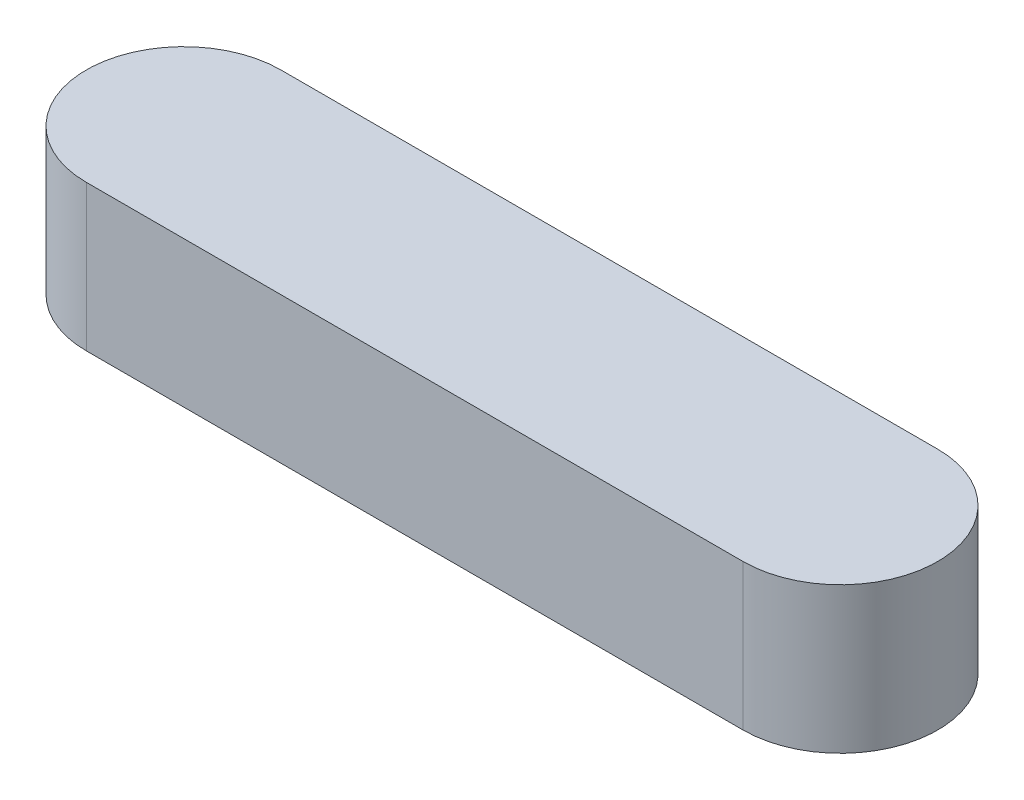
ISO-10303-21;
HEADER;
FILE_DESCRIPTION(('STEP AP214'),'2;1');
FILE_NAME('part.step','',(''),(''),'','','');
FILE_SCHEMA(('AUTOMOTIVE_DESIGN { 1 0 10303 214 1 1 1 1 }'));
ENDSEC;
DATA;
#1=APPLICATION_CONTEXT('core data for automotive mechanical design processes');
#2=APPLICATION_PROTOCOL_DEFINITION('international standard','automotive_design',2000,#1);
#3=PRODUCT_CONTEXT('',#1,'mechanical');
#4=PRODUCT('Part','Part','',(#3));
#5=PRODUCT_RELATED_PRODUCT_CATEGORY('part','',(#4));
#6=PRODUCT_DEFINITION_FORMATION('','',#4);
#7=PRODUCT_DEFINITION_CONTEXT('part definition',#1,'design');
#8=PRODUCT_DEFINITION('design','',#6,#7);
#9=PRODUCT_DEFINITION_SHAPE('','',#8);
#10=(LENGTH_UNIT() NAMED_UNIT(*) SI_UNIT(.MILLI.,.METRE.));
#11=(NAMED_UNIT(*) PLANE_ANGLE_UNIT() SI_UNIT($,.RADIAN.));
#12=(NAMED_UNIT(*) SI_UNIT($,.STERADIAN.) SOLID_ANGLE_UNIT());
#13=UNCERTAINTY_MEASURE_WITH_UNIT(LENGTH_MEASURE(1.E-05),#10,'distance_accuracy_value','');
#14=(GEOMETRIC_REPRESENTATION_CONTEXT(3) GLOBAL_UNCERTAINTY_ASSIGNED_CONTEXT((#13)) GLOBAL_UNIT_ASSIGNED_CONTEXT((#10,
#11,#12)) REPRESENTATION_CONTEXT('',''));
#15=CARTESIAN_POINT('',(0.,0.,0.));
#16=DIRECTION('',(0.,0.,1.));
#17=DIRECTION('',(1.,0.,0.));
#18=AXIS2_PLACEMENT_3D('',#15,#16,#17);
#19=CARTESIAN_POINT('',(-27.,12.,0.));
#20=DIRECTION('',(0.,-1.,0.));
#21=DIRECTION('',(0.,0.,-1.));
#22=AXIS2_PLACEMENT_3D('',#19,#20,#21);
#23=CYLINDRICAL_SURFACE('',#22,8.00000000000001);
#24=CARTESIAN_POINT('',(-27.,0.,0.));
#25=DIRECTION('',(0.,1.,0.));
#26=DIRECTION('',(0.,0.,1.));
#27=AXIS2_PLACEMENT_3D('',#24,#25,#26);
#28=CIRCLE('',#27,8.00000000000001);
#29=CARTESIAN_POINT('',(-27.,0.,-8.00000000000001));
#30=VERTEX_POINT('',#29);
#31=CARTESIAN_POINT('',(-27.,0.,8.00000000000001));
#32=VERTEX_POINT('',#31);
#33=EDGE_CURVE('E99',#30,#32,#28,.T.);
#34=ORIENTED_EDGE('',*,*,#33,.T.);
#35=DIRECTION('',(0.,-1.,0.));
#36=VECTOR('',#35,1.);
#37=CARTESIAN_POINT('',(-27.,12.,8.00000000000001));
#38=LINE('',#37,#36);
#39=CARTESIAN_POINT('',(-27.,12.,8.00000000000001));
#40=VERTEX_POINT('',#39);
#41=EDGE_CURVE('E11',#40,#32,#38,.T.);
#42=ORIENTED_EDGE('',*,*,#41,.F.);
#43=CARTESIAN_POINT('',(-27.,12.,0.));
#44=DIRECTION('',(0.,1.,0.));
#45=DIRECTION('',(0.,0.,1.));
#46=AXIS2_PLACEMENT_3D('',#43,#44,#45);
#47=CIRCLE('',#46,8.00000000000001);
#48=CARTESIAN_POINT('',(-27.,12.,-8.00000000000001));
#49=VERTEX_POINT('',#48);
#50=EDGE_CURVE('E86',#49,#40,#47,.T.);
#51=ORIENTED_EDGE('',*,*,#50,.F.);
#52=DIRECTION('',(0.,-1.,0.));
#53=VECTOR('',#52,1.);
#54=CARTESIAN_POINT('',(-27.,12.,-8.00000000000001));
#55=LINE('',#54,#53);
#56=EDGE_CURVE('E96',#49,#30,#55,.T.);
#57=ORIENTED_EDGE('',*,*,#56,.T.);
#58=EDGE_LOOP('',(#34,#42,#51,#57));
#59=FACE_BOUND('',#58,.T.);
#60=ADVANCED_FACE('F40',(#59),#23,.T.);
#61=CARTESIAN_POINT('',(-27.,12.,8.00000000000001));
#62=DIRECTION('',(0.,0.,-1.));
#63=DIRECTION('',(-1.,0.,0.));
#64=AXIS2_PLACEMENT_3D('',#61,#62,#63);
#65=PLANE('',#64);
#66=DIRECTION('',(1.,0.,0.));
#67=VECTOR('',#66,1.);
#68=CARTESIAN_POINT('',(-27.,0.,8.00000000000001));
#69=LINE('',#68,#67);
#70=CARTESIAN_POINT('',(27.,0.,8.));
#71=VERTEX_POINT('',#70);
#72=EDGE_CURVE('E95',#32,#71,#69,.T.);
#73=ORIENTED_EDGE('',*,*,#72,.T.);
#74=DIRECTION('',(0.,-1.,0.));
#75=VECTOR('',#74,1.);
#76=CARTESIAN_POINT('',(27.,12.,8.));
#77=LINE('',#76,#75);
#78=CARTESIAN_POINT('',(27.,12.,8.));
#79=VERTEX_POINT('',#78);
#80=EDGE_CURVE('E44',#79,#71,#77,.T.);
#81=ORIENTED_EDGE('',*,*,#80,.F.);
#82=DIRECTION('',(1.,0.,0.));
#83=VECTOR('',#82,1.);
#84=CARTESIAN_POINT('',(-27.,12.,8.00000000000001));
#85=LINE('',#84,#83);
#86=EDGE_CURVE('E85',#40,#79,#85,.T.);
#87=ORIENTED_EDGE('',*,*,#86,.F.);
#88=ORIENTED_EDGE('',*,*,#41,.T.);
#89=EDGE_LOOP('',(#73,#81,#87,#88));
#90=FACE_BOUND('',#89,.T.);
#91=ADVANCED_FACE('F93',(#90),#65,.F.);
#92=CARTESIAN_POINT('',(27.,12.,0.));
#93=DIRECTION('',(0.,-1.,0.));
#94=DIRECTION('',(0.,0.,-1.));
#95=AXIS2_PLACEMENT_3D('',#92,#93,#94);
#96=CYLINDRICAL_SURFACE('',#95,8.00000000000001);
#97=CARTESIAN_POINT('',(27.,0.,0.));
#98=DIRECTION('',(0.,1.,0.));
#99=DIRECTION('',(0.,0.,1.));
#100=AXIS2_PLACEMENT_3D('',#97,#98,#99);
#101=CIRCLE('',#100,8.00000000000001);
#102=CARTESIAN_POINT('',(27.,0.,-8.00000000000002));
#103=VERTEX_POINT('',#102);
#104=EDGE_CURVE('E69',#71,#103,#101,.T.);
#105=ORIENTED_EDGE('',*,*,#104,.T.);
#106=DIRECTION('',(0.,-1.,0.));
#107=VECTOR('',#106,1.);
#108=CARTESIAN_POINT('',(27.,12.,-8.00000000000002));
#109=LINE('',#108,#107);
#110=CARTESIAN_POINT('',(27.,12.,-8.00000000000002));
#111=VERTEX_POINT('',#110);
#112=EDGE_CURVE('E91',#111,#103,#109,.T.);
#113=ORIENTED_EDGE('',*,*,#112,.F.);
#114=CARTESIAN_POINT('',(27.,12.,0.));
#115=DIRECTION('',(0.,1.,0.));
#116=DIRECTION('',(0.,0.,1.));
#117=AXIS2_PLACEMENT_3D('',#114,#115,#116);
#118=CIRCLE('',#117,8.00000000000001);
#119=EDGE_CURVE('E88',#79,#111,#118,.T.);
#120=ORIENTED_EDGE('',*,*,#119,.F.);
#121=ORIENTED_EDGE('',*,*,#80,.T.);
#122=EDGE_LOOP('',(#105,#113,#120,#121));
#123=FACE_BOUND('',#122,.T.);
#124=ADVANCED_FACE('F94',(#123),#96,.T.);
#125=CARTESIAN_POINT('',(-27.,12.,-8.00000000000001));
#126=DIRECTION('',(0.,0.,1.));
#127=DIRECTION('',(1.,0.,0.));
#128=AXIS2_PLACEMENT_3D('',#125,#126,#127);
#129=PLANE('',#128);
#130=DIRECTION('',(-1.,0.,0.));
#131=VECTOR('',#130,1.);
#132=CARTESIAN_POINT('',(-27.,0.,-8.00000000000001));
#133=LINE('',#132,#131);
#134=EDGE_CURVE('E77',#103,#30,#133,.T.);
#135=ORIENTED_EDGE('',*,*,#134,.T.);
#136=ORIENTED_EDGE('',*,*,#56,.F.);
#137=DIRECTION('',(-1.,0.,0.));
#138=VECTOR('',#137,1.);
#139=CARTESIAN_POINT('',(-27.,12.,-8.00000000000001));
#140=LINE('',#139,#138);
#141=EDGE_CURVE('E52',#111,#49,#140,.T.);
#142=ORIENTED_EDGE('',*,*,#141,.F.);
#143=ORIENTED_EDGE('',*,*,#112,.T.);
#144=EDGE_LOOP('',(#135,#136,#142,#143));
#145=FACE_BOUND('',#144,.T.);
#146=ADVANCED_FACE('F110',(#145),#129,.F.);
#147=CARTESIAN_POINT('',(-27.,12.,0.));
#148=DIRECTION('',(0.,1.,0.));
#149=DIRECTION('',(0.,0.,1.));
#150=AXIS2_PLACEMENT_3D('',#147,#148,#149);
#151=PLANE('',#150);
#152=ORIENTED_EDGE('',*,*,#50,.T.);
#153=ORIENTED_EDGE('',*,*,#86,.T.);
#154=ORIENTED_EDGE('',*,*,#119,.T.);
#155=ORIENTED_EDGE('',*,*,#141,.T.);
#156=EDGE_LOOP('',(#152,#153,#154,#155));
#157=FACE_BOUND('',#156,.T.);
#158=ADVANCED_FACE('F83',(#157),#151,.T.);
#159=CARTESIAN_POINT('',(-27.,0.,0.));
#160=DIRECTION('',(0.,1.,0.));
#161=DIRECTION('',(0.,0.,1.));
#162=AXIS2_PLACEMENT_3D('',#159,#160,#161);
#163=PLANE('',#162);
#164=ORIENTED_EDGE('',*,*,#33,.F.);
#165=ORIENTED_EDGE('',*,*,#134,.F.);
#166=ORIENTED_EDGE('',*,*,#104,.F.);
#167=ORIENTED_EDGE('',*,*,#72,.F.);
#168=EDGE_LOOP('',(#164,#165,#166,#167));
#169=FACE_BOUND('',#168,.T.);
#170=ADVANCED_FACE('F109',(#169),#163,.F.);
#171=CLOSED_SHELL('',(#60,#91,#124,#146,#158,#170));
#172=MANIFOLD_SOLID_BREP('B2',#171);
#173=ADVANCED_BREP_SHAPE_REPRESENTATION('',(#18,#172),#14);
#174=SHAPE_DEFINITION_REPRESENTATION(#9,#173);
ENDSEC;
END-ISO-10303-21;
